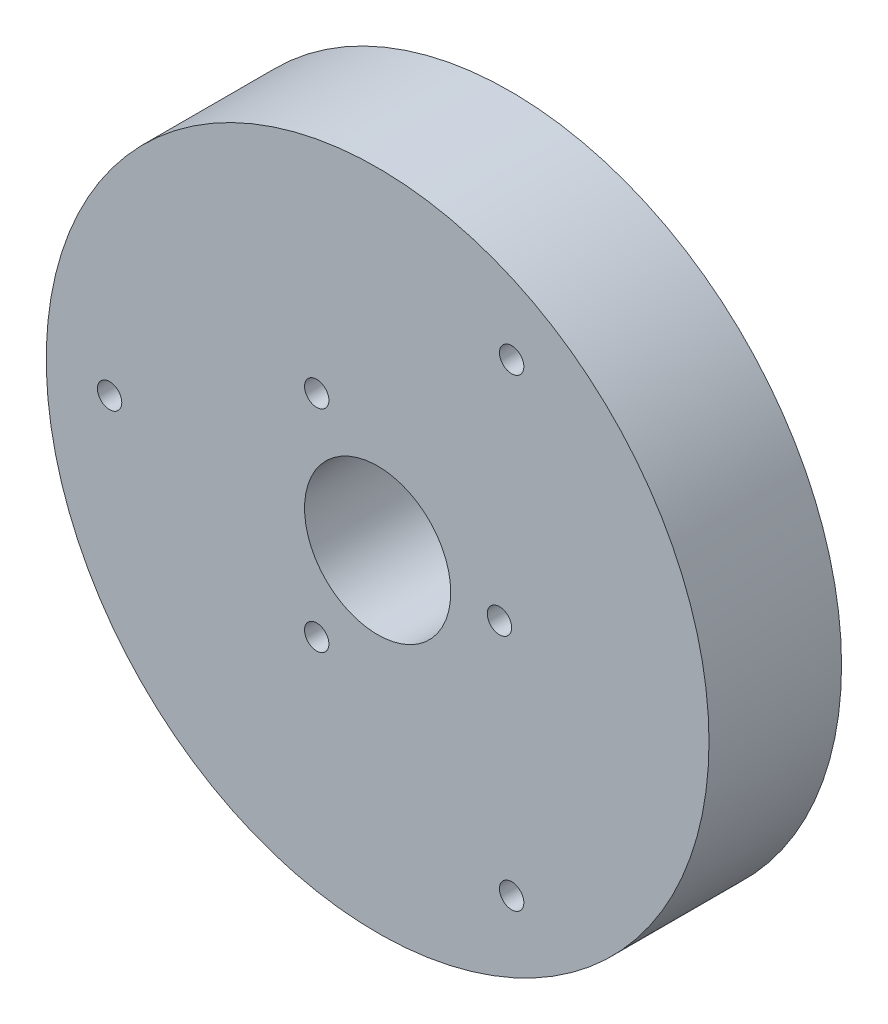
ISO-10303-21;
HEADER;
FILE_DESCRIPTION(('STEP AP214'),'2;1');
FILE_NAME('part.step','',(''),(''),'','','');
FILE_SCHEMA(('AUTOMOTIVE_DESIGN { 1 0 10303 214 1 1 1 1 }'));
ENDSEC;
DATA;
#1=APPLICATION_CONTEXT('core data for automotive mechanical design processes');
#2=APPLICATION_PROTOCOL_DEFINITION('international standard','automotive_design',2000,#1);
#3=PRODUCT_CONTEXT('',#1,'mechanical');
#4=PRODUCT('Part','Part','',(#3));
#5=PRODUCT_RELATED_PRODUCT_CATEGORY('part','',(#4));
#6=PRODUCT_DEFINITION_FORMATION('','',#4);
#7=PRODUCT_DEFINITION_CONTEXT('part definition',#1,'design');
#8=PRODUCT_DEFINITION('design','',#6,#7);
#9=PRODUCT_DEFINITION_SHAPE('','',#8);
#10=(LENGTH_UNIT() NAMED_UNIT(*) SI_UNIT(.MILLI.,.METRE.));
#11=(NAMED_UNIT(*) PLANE_ANGLE_UNIT() SI_UNIT($,.RADIAN.));
#12=(NAMED_UNIT(*) SI_UNIT($,.STERADIAN.) SOLID_ANGLE_UNIT());
#13=UNCERTAINTY_MEASURE_WITH_UNIT(LENGTH_MEASURE(1.E-05),#10,'distance_accuracy_value','');
#14=(GEOMETRIC_REPRESENTATION_CONTEXT(3) GLOBAL_UNCERTAINTY_ASSIGNED_CONTEXT((#13)) GLOBAL_UNIT_ASSIGNED_CONTEXT((#10,
#11,#12)) REPRESENTATION_CONTEXT('',''));
#15=CARTESIAN_POINT('',(0.,0.,0.));
#16=DIRECTION('',(0.,0.,1.));
#17=DIRECTION('',(1.,0.,0.));
#18=AXIS2_PLACEMENT_3D('',#15,#16,#17);
#19=CARTESIAN_POINT('',(0.,0.,0.));
#20=DIRECTION('',(0.,0.,1.));
#21=DIRECTION('',(1.,0.,0.));
#22=AXIS2_PLACEMENT_3D('',#19,#20,#21);
#23=CYLINDRICAL_SURFACE('',#22,7.5);
#24=CARTESIAN_POINT('',(0.,0.,0.));
#25=DIRECTION('',(0.,0.,1.));
#26=DIRECTION('',(1.,0.,0.));
#27=AXIS2_PLACEMENT_3D('',#24,#25,#26);
#28=CIRCLE('',#27,7.5);
#29=CARTESIAN_POINT('',(7.5,0.,0.));
#30=VERTEX_POINT('',#29);
#31=EDGE_CURVE('E48',#30,#30,#28,.T.);
#32=CARTESIAN_POINT('',(0.,0.,13.6));
#33=DIRECTION('',(0.,0.,1.));
#34=DIRECTION('',(1.,0.,0.));
#35=AXIS2_PLACEMENT_3D('',#32,#33,#34);
#36=CIRCLE('',#35,7.5);
#37=CARTESIAN_POINT('',(7.5,0.,13.6));
#38=VERTEX_POINT('',#37);
#39=EDGE_CURVE('E79',#38,#38,#36,.F.);
#40=CARTESIAN_POINT('',(7.5,0.,0.));
#41=CARTESIAN_POINT('',(7.5,0.,0.141666666666666));
#42=CARTESIAN_POINT('',(7.5,0.,0.283333333333333));
#43=CARTESIAN_POINT('',(7.5,0.,0.566666666666667));
#44=CARTESIAN_POINT('',(7.5,0.,0.708333333333333));
#45=CARTESIAN_POINT('',(7.5,0.,0.991666666666666));
#46=CARTESIAN_POINT('',(7.5,0.,1.13333333333333));
#47=CARTESIAN_POINT('',(7.5,0.,1.41666666666667));
#48=CARTESIAN_POINT('',(7.5,0.,1.55833333333333));
#49=CARTESIAN_POINT('',(7.5,0.,1.84166666666667));
#50=CARTESIAN_POINT('',(7.5,0.,1.98333333333333));
#51=CARTESIAN_POINT('',(7.5,0.,2.26666666666667));
#52=CARTESIAN_POINT('',(7.5,0.,2.40833333333333));
#53=CARTESIAN_POINT('',(7.5,0.,2.69166666666667));
#54=CARTESIAN_POINT('',(7.5,0.,2.83333333333333));
#55=CARTESIAN_POINT('',(7.5,0.,3.11666666666667));
#56=CARTESIAN_POINT('',(7.5,0.,3.25833333333333));
#57=CARTESIAN_POINT('',(7.5,0.,3.54166666666667));
#58=CARTESIAN_POINT('',(7.5,0.,3.68333333333333));
#59=CARTESIAN_POINT('',(7.5,0.,3.96666666666667));
#60=CARTESIAN_POINT('',(7.5,0.,4.10833333333333));
#61=CARTESIAN_POINT('',(7.5,0.,4.39166666666667));
#62=CARTESIAN_POINT('',(7.5,0.,4.53333333333333));
#63=CARTESIAN_POINT('',(7.5,0.,4.81666666666667));
#64=CARTESIAN_POINT('',(7.5,0.,4.95833333333333));
#65=CARTESIAN_POINT('',(7.5,0.,5.24166666666667));
#66=CARTESIAN_POINT('',(7.5,0.,5.38333333333333));
#67=CARTESIAN_POINT('',(7.5,0.,5.66666666666667));
#68=CARTESIAN_POINT('',(7.5,0.,5.80833333333333));
#69=CARTESIAN_POINT('',(7.5,0.,6.09166666666667));
#70=CARTESIAN_POINT('',(7.5,0.,6.23333333333333));
#71=CARTESIAN_POINT('',(7.5,0.,6.51666666666667));
#72=CARTESIAN_POINT('',(7.5,0.,6.65833333333333));
#73=CARTESIAN_POINT('',(7.5,0.,6.94166666666667));
#74=CARTESIAN_POINT('',(7.5,0.,7.08333333333333));
#75=CARTESIAN_POINT('',(7.5,0.,7.36666666666667));
#76=CARTESIAN_POINT('',(7.5,0.,7.50833333333333));
#77=CARTESIAN_POINT('',(7.5,0.,7.79166666666667));
#78=CARTESIAN_POINT('',(7.5,0.,7.93333333333333));
#79=CARTESIAN_POINT('',(7.5,0.,8.21666666666667));
#80=CARTESIAN_POINT('',(7.5,0.,8.35833333333333));
#81=CARTESIAN_POINT('',(7.5,0.,8.64166666666667));
#82=CARTESIAN_POINT('',(7.5,0.,8.78333333333333));
#83=CARTESIAN_POINT('',(7.5,0.,9.06666666666667));
#84=CARTESIAN_POINT('',(7.5,0.,9.20833333333333));
#85=CARTESIAN_POINT('',(7.5,0.,9.49166666666667));
#86=CARTESIAN_POINT('',(7.5,0.,9.63333333333333));
#87=CARTESIAN_POINT('',(7.5,0.,9.91666666666667));
#88=CARTESIAN_POINT('',(7.5,0.,10.0583333333333));
#89=CARTESIAN_POINT('',(7.5,0.,10.3416666666667));
#90=CARTESIAN_POINT('',(7.5,0.,10.4833333333333));
#91=CARTESIAN_POINT('',(7.5,0.,10.7666666666667));
#92=CARTESIAN_POINT('',(7.5,0.,10.9083333333333));
#93=CARTESIAN_POINT('',(7.5,0.,11.1916666666667));
#94=CARTESIAN_POINT('',(7.5,0.,11.3333333333333));
#95=CARTESIAN_POINT('',(7.5,0.,11.6166666666667));
#96=CARTESIAN_POINT('',(7.5,0.,11.7583333333333));
#97=CARTESIAN_POINT('',(7.5,0.,12.0416666666667));
#98=CARTESIAN_POINT('',(7.5,0.,12.1833333333333));
#99=CARTESIAN_POINT('',(7.5,0.,12.4666666666667));
#100=CARTESIAN_POINT('',(7.5,0.,12.6083333333333));
#101=CARTESIAN_POINT('',(7.5,0.,12.8916666666667));
#102=CARTESIAN_POINT('',(7.5,0.,13.0333333333333));
#103=CARTESIAN_POINT('',(7.5,0.,13.3166666666667));
#104=CARTESIAN_POINT('',(7.5,0.,13.4583333333333));
#105=CARTESIAN_POINT('',(7.5,0.,13.6));
#106=B_SPLINE_CURVE_WITH_KNOTS('',3,(#40,#41,#42,#43,#44,#45,#46,#47,#48,#49,#50,#51,#52,#53,
#54,#55,#56,#57,#58,#59,#60,#61,#62,#63,#64,#65,#66,#67,#68,#69,#70,#71,#72,#73,#74,#75,#76,#77,
#78,#79,#80,#81,#82,#83,#84,#85,#86,#87,#88,#89,#90,#91,#92,#93,#94,#95,#96,#97,#98,#99,#100,
#101,#102,#103,#104,#105),.UNSPECIFIED.,.F.,.F.,(4,2,2,2,2,2,2,2,2,2,2,2,2,2,2,2,2,2,2,2,2,2,2,
2,2,2,2,2,2,2,2,2,4),(0.,0.425,0.85,1.275,1.7,2.125,2.55,2.975,3.4,3.825,4.25,4.675,5.1,5.525,
5.95,6.375,6.8,7.225,7.65,8.075,8.5,8.925,9.35,9.775,10.2,10.625,11.05,11.475,11.9,12.325,12.75,
13.175,13.6),.UNSPECIFIED.);
#107=EDGE_CURVE('BSEAM35',#30,#38,#106,.T.);
#108=ORIENTED_EDGE('',*,*,#31,.F.);
#109=ORIENTED_EDGE('',*,*,#39,.F.);
#110=ORIENTED_EDGE('',*,*,#107,.T.);
#111=ORIENTED_EDGE('',*,*,#107,.F.);
#112=EDGE_LOOP('',(#108,#110,#109,#111));
#113=FACE_BOUND('',#112,.T.);
#114=ADVANCED_FACE('F35',(#113),#23,.F.);
#115=CARTESIAN_POINT('',(12.5,0.,0.));
#116=DIRECTION('',(0.,0.,-1.));
#117=DIRECTION('',(-1.,0.,0.));
#118=AXIS2_PLACEMENT_3D('',#115,#116,#117);
#119=CYLINDRICAL_SURFACE('',#118,1.24999999999999);
#120=CARTESIAN_POINT('',(12.5,0.,0.));
#121=DIRECTION('',(0.,0.,-1.));
#122=DIRECTION('',(-1.,0.,0.));
#123=AXIS2_PLACEMENT_3D('',#120,#121,#122);
#124=CIRCLE('',#123,1.24999999999999);
#125=CARTESIAN_POINT('',(11.25,0.,0.));
#126=VERTEX_POINT('',#125);
#127=EDGE_CURVE('E52',#126,#126,#124,.T.);
#128=ORIENTED_EDGE('',*,*,#127,.T.);
#129=EDGE_LOOP('',(#128));
#130=FACE_BOUND('',#129,.T.);
#131=CARTESIAN_POINT('',(12.5,0.,13.6));
#132=DIRECTION('',(0.,0.,1.));
#133=DIRECTION('',(1.,0.,0.));
#134=AXIS2_PLACEMENT_3D('',#131,#132,#133);
#135=CIRCLE('',#134,1.24999999999999);
#136=CARTESIAN_POINT('',(13.75,0.,13.6));
#137=VERTEX_POINT('',#136);
#138=EDGE_CURVE('E82',#137,#137,#135,.F.);
#139=ORIENTED_EDGE('',*,*,#138,.F.);
#140=EDGE_LOOP('',(#139));
#141=FACE_BOUND('',#140,.T.);
#142=ADVANCED_FACE('F106',(#130,#141),#119,.F.);
#143=CARTESIAN_POINT('',(-6.24999999999994,-10.8253175473055,0.));
#144=DIRECTION('',(0.,0.,-1.));
#145=DIRECTION('',(-1.,0.,0.));
#146=AXIS2_PLACEMENT_3D('',#143,#144,#145);
#147=CYLINDRICAL_SURFACE('',#146,1.24999999999999);
#148=CARTESIAN_POINT('',(-6.24999999999994,-10.8253175473055,0.));
#149=DIRECTION('',(0.,0.,-1.));
#150=DIRECTION('',(-1.,0.,0.));
#151=AXIS2_PLACEMENT_3D('',#148,#149,#150);
#152=CIRCLE('',#151,1.24999999999999);
#153=CARTESIAN_POINT('',(-7.49999999999993,-10.8253175473055,0.));
#154=VERTEX_POINT('',#153);
#155=EDGE_CURVE('E55',#154,#154,#152,.T.);
#156=ORIENTED_EDGE('',*,*,#155,.T.);
#157=EDGE_LOOP('',(#156));
#158=FACE_BOUND('',#157,.T.);
#159=CARTESIAN_POINT('',(-6.24999999999994,-10.8253175473055,13.6));
#160=DIRECTION('',(0.,0.,1.));
#161=DIRECTION('',(1.,0.,0.));
#162=AXIS2_PLACEMENT_3D('',#159,#160,#161);
#163=CIRCLE('',#162,1.24999999999999);
#164=CARTESIAN_POINT('',(-4.99999999999995,-10.8253175473055,13.6));
#165=VERTEX_POINT('',#164);
#166=EDGE_CURVE('E85',#165,#165,#163,.F.);
#167=ORIENTED_EDGE('',*,*,#166,.F.);
#168=EDGE_LOOP('',(#167));
#169=FACE_BOUND('',#168,.T.);
#170=ADVANCED_FACE('F97',(#158,#169),#147,.F.);
#171=CARTESIAN_POINT('',(-6.24999999999997,10.8253175473055,0.));
#172=DIRECTION('',(0.,0.,-1.));
#173=DIRECTION('',(-1.,0.,0.));
#174=AXIS2_PLACEMENT_3D('',#171,#172,#173);
#175=CYLINDRICAL_SURFACE('',#174,1.24999999999999);
#176=CARTESIAN_POINT('',(-6.24999999999997,10.8253175473055,0.));
#177=DIRECTION('',(0.,0.,-1.));
#178=DIRECTION('',(-1.,0.,0.));
#179=AXIS2_PLACEMENT_3D('',#176,#177,#178);
#180=CIRCLE('',#179,1.24999999999999);
#181=CARTESIAN_POINT('',(-7.49999999999996,10.8253175473055,0.));
#182=VERTEX_POINT('',#181);
#183=EDGE_CURVE('E58',#182,#182,#180,.T.);
#184=ORIENTED_EDGE('',*,*,#183,.T.);
#185=EDGE_LOOP('',(#184));
#186=FACE_BOUND('',#185,.T.);
#187=CARTESIAN_POINT('',(-6.24999999999997,10.8253175473055,13.6));
#188=DIRECTION('',(0.,0.,1.));
#189=DIRECTION('',(1.,0.,0.));
#190=AXIS2_PLACEMENT_3D('',#187,#188,#189);
#191=CIRCLE('',#190,1.24999999999999);
#192=CARTESIAN_POINT('',(-4.99999999999998,10.8253175473055,13.6));
#193=VERTEX_POINT('',#192);
#194=EDGE_CURVE('E39',#193,#193,#191,.F.);
#195=ORIENTED_EDGE('',*,*,#194,.F.);
#196=EDGE_LOOP('',(#195));
#197=FACE_BOUND('',#196,.T.);
#198=ADVANCED_FACE('F95',(#186,#197),#175,.F.);
#199=CARTESIAN_POINT('',(0.,0.,13.6));
#200=DIRECTION('',(0.,0.,1.));
#201=DIRECTION('',(1.,0.,0.));
#202=AXIS2_PLACEMENT_3D('',#199,#200,#201);
#203=PLANE('',#202);
#204=CARTESIAN_POINT('',(13.75,23.8156986040721,13.6));
#205=DIRECTION('',(0.,0.,1.));
#206=DIRECTION('',(1.,0.,0.));
#207=AXIS2_PLACEMENT_3D('',#204,#205,#206);
#208=CIRCLE('',#207,1.24999999999999);
#209=CARTESIAN_POINT('',(15.,23.8156986040721,13.6));
#210=VERTEX_POINT('',#209);
#211=EDGE_CURVE('E73',#210,#210,#208,.T.);
#212=ORIENTED_EDGE('',*,*,#211,.F.);
#213=EDGE_LOOP('',(#212));
#214=FACE_BOUND('',#213,.T.);
#215=CARTESIAN_POINT('',(-27.5,0.,13.6));
#216=DIRECTION('',(0.,0.,1.));
#217=DIRECTION('',(1.,0.,0.));
#218=AXIS2_PLACEMENT_3D('',#215,#216,#217);
#219=CIRCLE('',#218,1.24999999999999);
#220=CARTESIAN_POINT('',(-26.25,0.,13.6));
#221=VERTEX_POINT('',#220);
#222=EDGE_CURVE('E67',#221,#221,#219,.T.);
#223=ORIENTED_EDGE('',*,*,#222,.F.);
#224=EDGE_LOOP('',(#223));
#225=FACE_BOUND('',#224,.T.);
#226=CARTESIAN_POINT('',(13.75,-23.8156986040721,13.6));
#227=DIRECTION('',(0.,0.,1.));
#228=DIRECTION('',(1.,0.,0.));
#229=AXIS2_PLACEMENT_3D('',#226,#227,#228);
#230=CIRCLE('',#229,1.24999999999999);
#231=CARTESIAN_POINT('',(15.,-23.8156986040721,13.6));
#232=VERTEX_POINT('',#231);
#233=EDGE_CURVE('E61',#232,#232,#230,.T.);
#234=ORIENTED_EDGE('',*,*,#233,.F.);
#235=EDGE_LOOP('',(#234));
#236=FACE_BOUND('',#235,.T.);
#237=CARTESIAN_POINT('',(0.,0.,13.6));
#238=DIRECTION('',(0.,0.,1.));
#239=DIRECTION('',(1.,0.,0.));
#240=AXIS2_PLACEMENT_3D('',#237,#238,#239);
#241=CIRCLE('',#240,34.);
#242=CARTESIAN_POINT('',(34.,0.,13.6));
#243=VERTEX_POINT('',#242);
#244=EDGE_CURVE('E10',#243,#243,#241,.T.);
#245=ORIENTED_EDGE('',*,*,#244,.T.);
#246=EDGE_LOOP('',(#245));
#247=FACE_BOUND('',#246,.T.);
#248=ORIENTED_EDGE('',*,*,#39,.T.);
#249=EDGE_LOOP('',(#248));
#250=FACE_BOUND('',#249,.T.);
#251=ORIENTED_EDGE('',*,*,#166,.T.);
#252=EDGE_LOOP('',(#251));
#253=FACE_BOUND('',#252,.T.);
#254=ORIENTED_EDGE('',*,*,#194,.T.);
#255=EDGE_LOOP('',(#254));
#256=FACE_BOUND('',#255,.T.);
#257=ORIENTED_EDGE('',*,*,#138,.T.);
#258=EDGE_LOOP('',(#257));
#259=FACE_BOUND('',#258,.T.);
#260=ADVANCED_FACE('F92',(#214,#225,#236,#247,#250,#253,#256,#259),#203,.T.);
#261=CARTESIAN_POINT('',(0.,0.,13.6));
#262=DIRECTION('',(0.,0.,-1.));
#263=DIRECTION('',(-1.,0.,0.));
#264=AXIS2_PLACEMENT_3D('',#261,#262,#263);
#265=CYLINDRICAL_SURFACE('',#264,34.);
#266=ORIENTED_EDGE('',*,*,#244,.F.);
#267=EDGE_LOOP('',(#266));
#268=FACE_BOUND('',#267,.T.);
#269=CARTESIAN_POINT('',(0.,0.,0.));
#270=DIRECTION('',(0.,0.,1.));
#271=DIRECTION('',(1.,0.,0.));
#272=AXIS2_PLACEMENT_3D('',#269,#270,#271);
#273=CIRCLE('',#272,34.);
#274=CARTESIAN_POINT('',(34.,0.,0.));
#275=VERTEX_POINT('',#274);
#276=EDGE_CURVE('E43',#275,#275,#273,.T.);
#277=ORIENTED_EDGE('',*,*,#276,.T.);
#278=EDGE_LOOP('',(#277));
#279=FACE_BOUND('',#278,.T.);
#280=ADVANCED_FACE('F37',(#268,#279),#265,.T.);
#281=CARTESIAN_POINT('',(0.,0.,0.));
#282=DIRECTION('',(0.,0.,1.));
#283=DIRECTION('',(1.,0.,0.));
#284=AXIS2_PLACEMENT_3D('',#281,#282,#283);
#285=PLANE('',#284);
#286=CARTESIAN_POINT('',(13.75,23.8156986040721,0.));
#287=DIRECTION('',(0.,0.,-1.));
#288=DIRECTION('',(-1.,0.,0.));
#289=AXIS2_PLACEMENT_3D('',#286,#287,#288);
#290=CIRCLE('',#289,1.24999999999999);
#291=CARTESIAN_POINT('',(12.5,23.8156986040721,0.));
#292=VERTEX_POINT('',#291);
#293=EDGE_CURVE('E76',#292,#292,#290,.T.);
#294=ORIENTED_EDGE('',*,*,#293,.F.);
#295=EDGE_LOOP('',(#294));
#296=FACE_BOUND('',#295,.T.);
#297=CARTESIAN_POINT('',(-27.5,0.,0.));
#298=DIRECTION('',(0.,0.,-1.));
#299=DIRECTION('',(-1.,0.,0.));
#300=AXIS2_PLACEMENT_3D('',#297,#298,#299);
#301=CIRCLE('',#300,1.24999999999999);
#302=CARTESIAN_POINT('',(-28.75,0.,0.));
#303=VERTEX_POINT('',#302);
#304=EDGE_CURVE('E70',#303,#303,#301,.T.);
#305=ORIENTED_EDGE('',*,*,#304,.F.);
#306=EDGE_LOOP('',(#305));
#307=FACE_BOUND('',#306,.T.);
#308=CARTESIAN_POINT('',(13.75,-23.8156986040721,0.));
#309=DIRECTION('',(0.,0.,-1.));
#310=DIRECTION('',(-1.,0.,0.));
#311=AXIS2_PLACEMENT_3D('',#308,#309,#310);
#312=CIRCLE('',#311,1.24999999999999);
#313=CARTESIAN_POINT('',(12.5,-23.8156986040721,0.));
#314=VERTEX_POINT('',#313);
#315=EDGE_CURVE('E64',#314,#314,#312,.T.);
#316=ORIENTED_EDGE('',*,*,#315,.F.);
#317=EDGE_LOOP('',(#316));
#318=FACE_BOUND('',#317,.T.);
#319=ORIENTED_EDGE('',*,*,#183,.F.);
#320=EDGE_LOOP('',(#319));
#321=FACE_BOUND('',#320,.T.);
#322=ORIENTED_EDGE('',*,*,#155,.F.);
#323=EDGE_LOOP('',(#322));
#324=FACE_BOUND('',#323,.T.);
#325=ORIENTED_EDGE('',*,*,#127,.F.);
#326=EDGE_LOOP('',(#325));
#327=FACE_BOUND('',#326,.T.);
#328=ORIENTED_EDGE('',*,*,#31,.T.);
#329=EDGE_LOOP('',(#328));
#330=FACE_BOUND('',#329,.T.);
#331=ORIENTED_EDGE('',*,*,#276,.F.);
#332=EDGE_LOOP('',(#331));
#333=FACE_BOUND('',#332,.T.);
#334=ADVANCED_FACE('F122',(#296,#307,#318,#321,#324,#327,#330,#333),#285,.F.);
#335=CARTESIAN_POINT('',(13.75,-23.8156986040721,0.));
#336=DIRECTION('',(0.,0.,-1.));
#337=DIRECTION('',(-1.,0.,0.));
#338=AXIS2_PLACEMENT_3D('',#335,#336,#337);
#339=CYLINDRICAL_SURFACE('',#338,1.24999999999999);
#340=ORIENTED_EDGE('',*,*,#233,.T.);
#341=EDGE_LOOP('',(#340));
#342=FACE_BOUND('',#341,.T.);
#343=ORIENTED_EDGE('',*,*,#315,.T.);
#344=EDGE_LOOP('',(#343));
#345=FACE_BOUND('',#344,.T.);
#346=ADVANCED_FACE('F124',(#342,#345),#339,.F.);
#347=CARTESIAN_POINT('',(-27.5,0.,0.));
#348=DIRECTION('',(0.,0.,-1.));
#349=DIRECTION('',(-1.,0.,0.));
#350=AXIS2_PLACEMENT_3D('',#347,#348,#349);
#351=CYLINDRICAL_SURFACE('',#350,1.24999999999999);
#352=ORIENTED_EDGE('',*,*,#222,.T.);
#353=EDGE_LOOP('',(#352));
#354=FACE_BOUND('',#353,.T.);
#355=ORIENTED_EDGE('',*,*,#304,.T.);
#356=EDGE_LOOP('',(#355));
#357=FACE_BOUND('',#356,.T.);
#358=ADVANCED_FACE('F131',(#354,#357),#351,.F.);
#359=CARTESIAN_POINT('',(13.75,23.8156986040721,0.));
#360=DIRECTION('',(0.,0.,-1.));
#361=DIRECTION('',(-1.,0.,0.));
#362=AXIS2_PLACEMENT_3D('',#359,#360,#361);
#363=CYLINDRICAL_SURFACE('',#362,1.24999999999999);
#364=ORIENTED_EDGE('',*,*,#211,.T.);
#365=EDGE_LOOP('',(#364));
#366=FACE_BOUND('',#365,.T.);
#367=ORIENTED_EDGE('',*,*,#293,.T.);
#368=EDGE_LOOP('',(#367));
#369=FACE_BOUND('',#368,.T.);
#370=ADVANCED_FACE('F156',(#366,#369),#363,.F.);
#371=CLOSED_SHELL('',(#114,#142,#170,#198,#260,#280,#334,#346,#358,#370));
#372=MANIFOLD_SOLID_BREP('B2',#371);
#373=ADVANCED_BREP_SHAPE_REPRESENTATION('',(#18,#372),#14);
#374=SHAPE_DEFINITION_REPRESENTATION(#9,#373);
ENDSEC;
END-ISO-10303-21;
